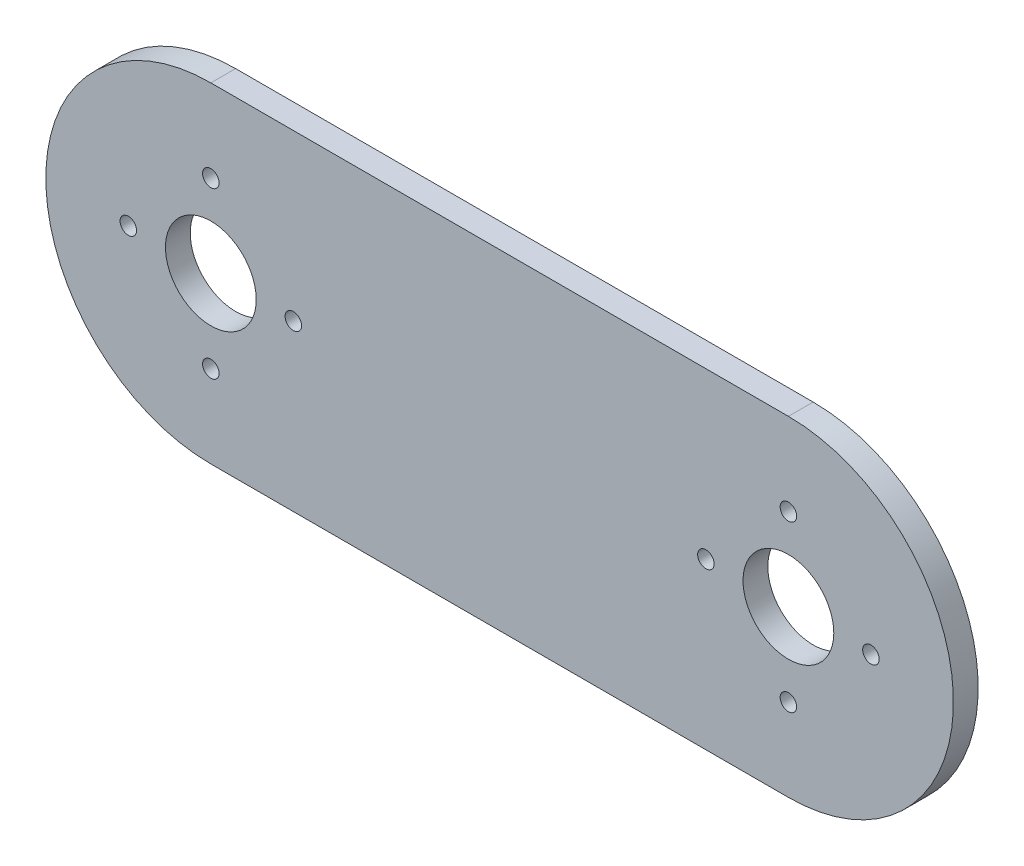
ISO-10303-21;
HEADER;
FILE_DESCRIPTION(('STEP AP214'),'2;1');
FILE_NAME('part.step','',(''),(''),'','','');
FILE_SCHEMA(('AUTOMOTIVE_DESIGN { 1 0 10303 214 1 1 1 1 }'));
ENDSEC;
DATA;
#1=APPLICATION_CONTEXT('core data for automotive mechanical design processes');
#2=APPLICATION_PROTOCOL_DEFINITION('international standard','automotive_design',2000,#1);
#3=PRODUCT_CONTEXT('',#1,'mechanical');
#4=PRODUCT('Part','Part','',(#3));
#5=PRODUCT_RELATED_PRODUCT_CATEGORY('part','',(#4));
#6=PRODUCT_DEFINITION_FORMATION('','',#4);
#7=PRODUCT_DEFINITION_CONTEXT('part definition',#1,'design');
#8=PRODUCT_DEFINITION('design','',#6,#7);
#9=PRODUCT_DEFINITION_SHAPE('','',#8);
#10=(LENGTH_UNIT() NAMED_UNIT(*) SI_UNIT(.MILLI.,.METRE.));
#11=(NAMED_UNIT(*) PLANE_ANGLE_UNIT() SI_UNIT($,.RADIAN.));
#12=(NAMED_UNIT(*) SI_UNIT($,.STERADIAN.) SOLID_ANGLE_UNIT());
#13=UNCERTAINTY_MEASURE_WITH_UNIT(LENGTH_MEASURE(1.E-05),#10,'distance_accuracy_value','');
#14=(GEOMETRIC_REPRESENTATION_CONTEXT(3) GLOBAL_UNCERTAINTY_ASSIGNED_CONTEXT((#13)) GLOBAL_UNIT_ASSIGNED_CONTEXT((#10,
#11,#12)) REPRESENTATION_CONTEXT('',''));
#15=CARTESIAN_POINT('',(0.,0.,0.));
#16=DIRECTION('',(0.,0.,1.));
#17=DIRECTION('',(1.,0.,0.));
#18=AXIS2_PLACEMENT_3D('',#15,#16,#17);
#19=CARTESIAN_POINT('',(0.,0.,3.));
#20=DIRECTION('',(0.,0.,1.));
#21=DIRECTION('',(1.,0.,0.));
#22=AXIS2_PLACEMENT_3D('',#19,#20,#21);
#23=PLANE('',#22);
#24=CARTESIAN_POINT('',(0.,0.,3.));
#25=DIRECTION('',(0.,0.,1.));
#26=DIRECTION('',(1.,0.,0.));
#27=AXIS2_PLACEMENT_3D('',#24,#25,#26);
#28=CIRCLE('',#27,5.5);
#29=CARTESIAN_POINT('',(5.5,0.,3.));
#30=VERTEX_POINT('',#29);
#31=EDGE_CURVE('E161',#30,#30,#28,.T.);
#32=ORIENTED_EDGE('',*,*,#31,.F.);
#33=EDGE_LOOP('',(#32));
#34=FACE_BOUND('',#33,.T.);
#35=CARTESIAN_POINT('',(70.,10.,3.));
#36=DIRECTION('',(0.,0.,1.));
#37=DIRECTION('',(1.,0.,0.));
#38=AXIS2_PLACEMENT_3D('',#35,#36,#37);
#39=CIRCLE('',#38,0.999999999999998);
#40=CARTESIAN_POINT('',(71.,10.,3.));
#41=VERTEX_POINT('',#40);
#42=EDGE_CURVE('E149',#41,#41,#39,.T.);
#43=ORIENTED_EDGE('',*,*,#42,.F.);
#44=EDGE_LOOP('',(#43));
#45=FACE_BOUND('',#44,.T.);
#46=CARTESIAN_POINT('',(0.,10.0000000000001,3.));
#47=DIRECTION('',(0.,0.,1.));
#48=DIRECTION('',(1.,0.,0.));
#49=AXIS2_PLACEMENT_3D('',#46,#47,#48);
#50=CIRCLE('',#49,1.);
#51=CARTESIAN_POINT('',(1.00000000000007,10.0000000000001,3.));
#52=VERTEX_POINT('',#51);
#53=EDGE_CURVE('E137',#52,#52,#50,.T.);
#54=ORIENTED_EDGE('',*,*,#53,.F.);
#55=EDGE_LOOP('',(#54));
#56=FACE_BOUND('',#55,.T.);
#57=CARTESIAN_POINT('',(0.,-9.99999999999993,3.));
#58=DIRECTION('',(0.,0.,1.));
#59=DIRECTION('',(1.,0.,0.));
#60=AXIS2_PLACEMENT_3D('',#57,#58,#59);
#61=CIRCLE('',#60,1.);
#62=CARTESIAN_POINT('',(0.99999999999993,-9.99999999999993,3.));
#63=VERTEX_POINT('',#62);
#64=EDGE_CURVE('E125',#63,#63,#61,.T.);
#65=ORIENTED_EDGE('',*,*,#64,.F.);
#66=EDGE_LOOP('',(#65));
#67=FACE_BOUND('',#66,.T.);
#68=CARTESIAN_POINT('',(10.,0.,3.));
#69=DIRECTION('',(0.,0.,1.));
#70=DIRECTION('',(1.,0.,0.));
#71=AXIS2_PLACEMENT_3D('',#68,#69,#70);
#72=CIRCLE('',#71,1.);
#73=CARTESIAN_POINT('',(11.,0.,3.));
#74=VERTEX_POINT('',#73);
#75=EDGE_CURVE('E104',#74,#74,#72,.T.);
#76=ORIENTED_EDGE('',*,*,#75,.F.);
#77=EDGE_LOOP('',(#76));
#78=FACE_BOUND('',#77,.T.);
#79=CARTESIAN_POINT('',(0.,0.,3.));
#80=DIRECTION('',(0.,0.,1.));
#81=DIRECTION('',(1.,0.,0.));
#82=AXIS2_PLACEMENT_3D('',#79,#80,#81);
#83=CIRCLE('',#82,20.);
#84=CARTESIAN_POINT('',(0.,20.,3.));
#85=VERTEX_POINT('',#84);
#86=CARTESIAN_POINT('',(0.,-20.,3.));
#87=VERTEX_POINT('',#86);
#88=EDGE_CURVE('E89',#85,#87,#83,.T.);
#89=ORIENTED_EDGE('',*,*,#88,.T.);
#90=DIRECTION('',(1.,0.,0.));
#91=VECTOR('',#90,1.);
#92=CARTESIAN_POINT('',(0.,-20.,3.));
#93=LINE('',#92,#91);
#94=CARTESIAN_POINT('',(70.,-20.,3.));
#95=VERTEX_POINT('',#94);
#96=EDGE_CURVE('E84',#87,#95,#93,.T.);
#97=ORIENTED_EDGE('',*,*,#96,.T.);
#98=CARTESIAN_POINT('',(70.,0.,3.));
#99=DIRECTION('',(0.,0.,1.));
#100=DIRECTION('',(1.,0.,0.));
#101=AXIS2_PLACEMENT_3D('',#98,#99,#100);
#102=CIRCLE('',#101,20.);
#103=CARTESIAN_POINT('',(70.,20.,3.));
#104=VERTEX_POINT('',#103);
#105=EDGE_CURVE('E87',#95,#104,#102,.T.);
#106=ORIENTED_EDGE('',*,*,#105,.T.);
#107=DIRECTION('',(-1.,0.,0.));
#108=VECTOR('',#107,1.);
#109=CARTESIAN_POINT('',(0.,20.,3.));
#110=LINE('',#109,#108);
#111=EDGE_CURVE('E54',#104,#85,#110,.T.);
#112=ORIENTED_EDGE('',*,*,#111,.T.);
#113=EDGE_LOOP('',(#89,#97,#106,#112));
#114=FACE_BOUND('',#113,.T.);
#115=CARTESIAN_POINT('',(80.,0.,3.));
#116=DIRECTION('',(0.,0.,1.));
#117=DIRECTION('',(1.,0.,0.));
#118=AXIS2_PLACEMENT_3D('',#115,#116,#117);
#119=CIRCLE('',#118,0.999999999999998);
#120=CARTESIAN_POINT('',(81.,0.,3.));
#121=VERTEX_POINT('',#120);
#122=EDGE_CURVE('E119',#121,#121,#119,.T.);
#123=ORIENTED_EDGE('',*,*,#122,.F.);
#124=EDGE_LOOP('',(#123));
#125=FACE_BOUND('',#124,.T.);
#126=CARTESIAN_POINT('',(-10.,1.41028062308632E-13,3.));
#127=DIRECTION('',(0.,0.,1.));
#128=DIRECTION('',(1.,0.,0.));
#129=AXIS2_PLACEMENT_3D('',#126,#127,#128);
#130=CIRCLE('',#129,1.);
#131=CARTESIAN_POINT('',(-9.,1.41028062308632E-13,3.));
#132=VERTEX_POINT('',#131);
#133=EDGE_CURVE('E131',#132,#132,#130,.T.);
#134=ORIENTED_EDGE('',*,*,#133,.F.);
#135=EDGE_LOOP('',(#134));
#136=FACE_BOUND('',#135,.T.);
#137=CARTESIAN_POINT('',(60.,0.,3.));
#138=DIRECTION('',(0.,0.,1.));
#139=DIRECTION('',(1.,0.,0.));
#140=AXIS2_PLACEMENT_3D('',#137,#138,#139);
#141=CIRCLE('',#140,0.999999999999998);
#142=CARTESIAN_POINT('',(61.,0.,3.));
#143=VERTEX_POINT('',#142);
#144=EDGE_CURVE('E143',#143,#143,#141,.T.);
#145=ORIENTED_EDGE('',*,*,#144,.F.);
#146=EDGE_LOOP('',(#145));
#147=FACE_BOUND('',#146,.T.);
#148=CARTESIAN_POINT('',(70.,-10.,3.));
#149=DIRECTION('',(0.,0.,1.));
#150=DIRECTION('',(1.,0.,0.));
#151=AXIS2_PLACEMENT_3D('',#148,#149,#150);
#152=CIRCLE('',#151,0.999999999999998);
#153=CARTESIAN_POINT('',(71.,-10.,3.));
#154=VERTEX_POINT('',#153);
#155=EDGE_CURVE('E155',#154,#154,#152,.T.);
#156=ORIENTED_EDGE('',*,*,#155,.F.);
#157=EDGE_LOOP('',(#156));
#158=FACE_BOUND('',#157,.T.);
#159=CARTESIAN_POINT('',(70.,0.,3.));
#160=DIRECTION('',(0.,0.,1.));
#161=DIRECTION('',(1.,0.,0.));
#162=AXIS2_PLACEMENT_3D('',#159,#160,#161);
#163=CIRCLE('',#162,5.5);
#164=CARTESIAN_POINT('',(75.5,0.,3.));
#165=VERTEX_POINT('',#164);
#166=EDGE_CURVE('E167',#165,#165,#163,.T.);
#167=ORIENTED_EDGE('',*,*,#166,.F.);
#168=EDGE_LOOP('',(#167));
#169=FACE_BOUND('',#168,.T.);
#170=ADVANCED_FACE('F37',(#34,#45,#56,#67,#78,#114,#125,#136,#147,#158,#169),#23,.T.);
#171=CARTESIAN_POINT('',(0.,0.,0.));
#172=DIRECTION('',(0.,0.,1.));
#173=DIRECTION('',(1.,0.,0.));
#174=AXIS2_PLACEMENT_3D('',#171,#172,#173);
#175=PLANE('',#174);
#176=CARTESIAN_POINT('',(0.,0.,0.));
#177=DIRECTION('',(0.,0.,1.));
#178=DIRECTION('',(1.,0.,0.));
#179=AXIS2_PLACEMENT_3D('',#176,#177,#178);
#180=CIRCLE('',#179,5.5);
#181=CARTESIAN_POINT('',(5.5,0.,0.));
#182=VERTEX_POINT('',#181);
#183=EDGE_CURVE('E164',#182,#182,#180,.T.);
#184=ORIENTED_EDGE('',*,*,#183,.T.);
#185=EDGE_LOOP('',(#184));
#186=FACE_BOUND('',#185,.T.);
#187=CARTESIAN_POINT('',(70.,10.,0.));
#188=DIRECTION('',(0.,0.,1.));
#189=DIRECTION('',(1.,0.,0.));
#190=AXIS2_PLACEMENT_3D('',#187,#188,#189);
#191=CIRCLE('',#190,0.999999999999998);
#192=CARTESIAN_POINT('',(71.,10.,0.));
#193=VERTEX_POINT('',#192);
#194=EDGE_CURVE('E152',#193,#193,#191,.T.);
#195=ORIENTED_EDGE('',*,*,#194,.T.);
#196=EDGE_LOOP('',(#195));
#197=FACE_BOUND('',#196,.T.);
#198=CARTESIAN_POINT('',(0.,10.0000000000001,0.));
#199=DIRECTION('',(0.,0.,1.));
#200=DIRECTION('',(1.,0.,0.));
#201=AXIS2_PLACEMENT_3D('',#198,#199,#200);
#202=CIRCLE('',#201,1.);
#203=CARTESIAN_POINT('',(1.00000000000007,10.0000000000001,0.));
#204=VERTEX_POINT('',#203);
#205=EDGE_CURVE('E140',#204,#204,#202,.T.);
#206=ORIENTED_EDGE('',*,*,#205,.T.);
#207=EDGE_LOOP('',(#206));
#208=FACE_BOUND('',#207,.T.);
#209=CARTESIAN_POINT('',(0.,-9.99999999999993,0.));
#210=DIRECTION('',(0.,0.,1.));
#211=DIRECTION('',(1.,0.,0.));
#212=AXIS2_PLACEMENT_3D('',#209,#210,#211);
#213=CIRCLE('',#212,1.);
#214=CARTESIAN_POINT('',(0.99999999999993,-9.99999999999993,0.));
#215=VERTEX_POINT('',#214);
#216=EDGE_CURVE('E128',#215,#215,#213,.T.);
#217=ORIENTED_EDGE('',*,*,#216,.T.);
#218=EDGE_LOOP('',(#217));
#219=FACE_BOUND('',#218,.T.);
#220=CARTESIAN_POINT('',(10.,0.,0.));
#221=DIRECTION('',(0.,0.,1.));
#222=DIRECTION('',(1.,0.,0.));
#223=AXIS2_PLACEMENT_3D('',#220,#221,#222);
#224=CIRCLE('',#223,1.);
#225=CARTESIAN_POINT('',(11.,0.,0.));
#226=VERTEX_POINT('',#225);
#227=EDGE_CURVE('E116',#226,#226,#224,.T.);
#228=ORIENTED_EDGE('',*,*,#227,.T.);
#229=EDGE_LOOP('',(#228));
#230=FACE_BOUND('',#229,.T.);
#231=CARTESIAN_POINT('',(0.,0.,0.));
#232=DIRECTION('',(0.,0.,1.));
#233=DIRECTION('',(1.,0.,0.));
#234=AXIS2_PLACEMENT_3D('',#231,#232,#233);
#235=CIRCLE('',#234,20.);
#236=CARTESIAN_POINT('',(0.,20.,0.));
#237=VERTEX_POINT('',#236);
#238=CARTESIAN_POINT('',(0.,-20.,0.));
#239=VERTEX_POINT('',#238);
#240=EDGE_CURVE('E101',#237,#239,#235,.T.);
#241=ORIENTED_EDGE('',*,*,#240,.F.);
#242=DIRECTION('',(-1.,0.,0.));
#243=VECTOR('',#242,1.);
#244=CARTESIAN_POINT('',(0.,20.,0.));
#245=LINE('',#244,#243);
#246=CARTESIAN_POINT('',(70.,20.,0.));
#247=VERTEX_POINT('',#246);
#248=EDGE_CURVE('E77',#247,#237,#245,.T.);
#249=ORIENTED_EDGE('',*,*,#248,.F.);
#250=CARTESIAN_POINT('',(70.,0.,0.));
#251=DIRECTION('',(0.,0.,1.));
#252=DIRECTION('',(1.,0.,0.));
#253=AXIS2_PLACEMENT_3D('',#250,#251,#252);
#254=CIRCLE('',#253,20.);
#255=CARTESIAN_POINT('',(70.,-20.,0.));
#256=VERTEX_POINT('',#255);
#257=EDGE_CURVE('E71',#256,#247,#254,.T.);
#258=ORIENTED_EDGE('',*,*,#257,.F.);
#259=DIRECTION('',(1.,0.,0.));
#260=VECTOR('',#259,1.);
#261=CARTESIAN_POINT('',(0.,-20.,0.));
#262=LINE('',#261,#260);
#263=EDGE_CURVE('E93',#239,#256,#262,.T.);
#264=ORIENTED_EDGE('',*,*,#263,.F.);
#265=EDGE_LOOP('',(#241,#249,#258,#264));
#266=FACE_BOUND('',#265,.T.);
#267=CARTESIAN_POINT('',(80.,0.,0.));
#268=DIRECTION('',(0.,0.,1.));
#269=DIRECTION('',(1.,0.,0.));
#270=AXIS2_PLACEMENT_3D('',#267,#268,#269);
#271=CIRCLE('',#270,0.999999999999998);
#272=CARTESIAN_POINT('',(81.,0.,0.));
#273=VERTEX_POINT('',#272);
#274=EDGE_CURVE('E122',#273,#273,#271,.T.);
#275=ORIENTED_EDGE('',*,*,#274,.T.);
#276=EDGE_LOOP('',(#275));
#277=FACE_BOUND('',#276,.T.);
#278=CARTESIAN_POINT('',(-10.,1.41028062308632E-13,0.));
#279=DIRECTION('',(0.,0.,1.));
#280=DIRECTION('',(1.,0.,0.));
#281=AXIS2_PLACEMENT_3D('',#278,#279,#280);
#282=CIRCLE('',#281,1.);
#283=CARTESIAN_POINT('',(-9.,1.41028062308632E-13,0.));
#284=VERTEX_POINT('',#283);
#285=EDGE_CURVE('E134',#284,#284,#282,.T.);
#286=ORIENTED_EDGE('',*,*,#285,.T.);
#287=EDGE_LOOP('',(#286));
#288=FACE_BOUND('',#287,.T.);
#289=CARTESIAN_POINT('',(60.,0.,0.));
#290=DIRECTION('',(0.,0.,1.));
#291=DIRECTION('',(1.,0.,0.));
#292=AXIS2_PLACEMENT_3D('',#289,#290,#291);
#293=CIRCLE('',#292,0.999999999999998);
#294=CARTESIAN_POINT('',(61.,0.,0.));
#295=VERTEX_POINT('',#294);
#296=EDGE_CURVE('E146',#295,#295,#293,.T.);
#297=ORIENTED_EDGE('',*,*,#296,.T.);
#298=EDGE_LOOP('',(#297));
#299=FACE_BOUND('',#298,.T.);
#300=CARTESIAN_POINT('',(70.,-10.,0.));
#301=DIRECTION('',(0.,0.,1.));
#302=DIRECTION('',(1.,0.,0.));
#303=AXIS2_PLACEMENT_3D('',#300,#301,#302);
#304=CIRCLE('',#303,0.999999999999998);
#305=CARTESIAN_POINT('',(71.,-10.,0.));
#306=VERTEX_POINT('',#305);
#307=EDGE_CURVE('E158',#306,#306,#304,.T.);
#308=ORIENTED_EDGE('',*,*,#307,.T.);
#309=EDGE_LOOP('',(#308));
#310=FACE_BOUND('',#309,.T.);
#311=CARTESIAN_POINT('',(70.,0.,0.));
#312=DIRECTION('',(0.,0.,1.));
#313=DIRECTION('',(1.,0.,0.));
#314=AXIS2_PLACEMENT_3D('',#311,#312,#313);
#315=CIRCLE('',#314,5.5);
#316=CARTESIAN_POINT('',(75.5,0.,0.));
#317=VERTEX_POINT('',#316);
#318=EDGE_CURVE('E170',#317,#317,#315,.T.);
#319=ORIENTED_EDGE('',*,*,#318,.T.);
#320=EDGE_LOOP('',(#319));
#321=FACE_BOUND('',#320,.T.);
#322=ADVANCED_FACE('F112',(#186,#197,#208,#219,#230,#266,#277,#288,#299,#310,#321),#175,.F.);
#323=CARTESIAN_POINT('',(0.,0.,3.));
#324=DIRECTION('',(0.,0.,-1.));
#325=DIRECTION('',(-1.,0.,0.));
#326=AXIS2_PLACEMENT_3D('',#323,#324,#325);
#327=CYLINDRICAL_SURFACE('',#326,20.);
#328=ORIENTED_EDGE('',*,*,#240,.T.);
#329=DIRECTION('',(0.,0.,-1.));
#330=VECTOR('',#329,1.);
#331=CARTESIAN_POINT('',(0.,-20.,3.));
#332=LINE('',#331,#330);
#333=EDGE_CURVE('E11',#87,#239,#332,.T.);
#334=ORIENTED_EDGE('',*,*,#333,.F.);
#335=ORIENTED_EDGE('',*,*,#88,.F.);
#336=DIRECTION('',(0.,0.,-1.));
#337=VECTOR('',#336,1.);
#338=CARTESIAN_POINT('',(0.,20.,3.));
#339=LINE('',#338,#337);
#340=EDGE_CURVE('E97',#85,#237,#339,.T.);
#341=ORIENTED_EDGE('',*,*,#340,.T.);
#342=EDGE_LOOP('',(#328,#334,#335,#341));
#343=FACE_BOUND('',#342,.T.);
#344=ADVANCED_FACE('F39',(#343),#327,.T.);
#345=CARTESIAN_POINT('',(0.,-20.,3.));
#346=DIRECTION('',(0.,1.,0.));
#347=DIRECTION('',(0.,0.,1.));
#348=AXIS2_PLACEMENT_3D('',#345,#346,#347);
#349=PLANE('',#348);
#350=ORIENTED_EDGE('',*,*,#263,.T.);
#351=DIRECTION('',(0.,0.,-1.));
#352=VECTOR('',#351,1.);
#353=CARTESIAN_POINT('',(70.,-20.,3.));
#354=LINE('',#353,#352);
#355=EDGE_CURVE('E46',#95,#256,#354,.T.);
#356=ORIENTED_EDGE('',*,*,#355,.F.);
#357=ORIENTED_EDGE('',*,*,#96,.F.);
#358=ORIENTED_EDGE('',*,*,#333,.T.);
#359=EDGE_LOOP('',(#350,#356,#357,#358));
#360=FACE_BOUND('',#359,.T.);
#361=ADVANCED_FACE('F92',(#360),#349,.F.);
#362=CARTESIAN_POINT('',(70.,0.,3.));
#363=DIRECTION('',(0.,0.,-1.));
#364=DIRECTION('',(-1.,0.,0.));
#365=AXIS2_PLACEMENT_3D('',#362,#363,#364);
#366=CYLINDRICAL_SURFACE('',#365,20.);
#367=ORIENTED_EDGE('',*,*,#257,.T.);
#368=DIRECTION('',(0.,0.,-1.));
#369=VECTOR('',#368,1.);
#370=CARTESIAN_POINT('',(70.,20.,3.));
#371=LINE('',#370,#369);
#372=EDGE_CURVE('E94',#104,#247,#371,.T.);
#373=ORIENTED_EDGE('',*,*,#372,.F.);
#374=ORIENTED_EDGE('',*,*,#105,.F.);
#375=ORIENTED_EDGE('',*,*,#355,.T.);
#376=EDGE_LOOP('',(#367,#373,#374,#375));
#377=FACE_BOUND('',#376,.T.);
#378=ADVANCED_FACE('F95',(#377),#366,.T.);
#379=CARTESIAN_POINT('',(0.,20.,3.));
#380=DIRECTION('',(0.,-1.,0.));
#381=DIRECTION('',(0.,0.,-1.));
#382=AXIS2_PLACEMENT_3D('',#379,#380,#381);
#383=PLANE('',#382);
#384=ORIENTED_EDGE('',*,*,#248,.T.);
#385=ORIENTED_EDGE('',*,*,#340,.F.);
#386=ORIENTED_EDGE('',*,*,#111,.F.);
#387=ORIENTED_EDGE('',*,*,#372,.T.);
#388=EDGE_LOOP('',(#384,#385,#386,#387));
#389=FACE_BOUND('',#388,.T.);
#390=ADVANCED_FACE('F109',(#389),#383,.F.);
#391=CARTESIAN_POINT('',(10.,0.,3.));
#392=DIRECTION('',(0.,0.,-1.));
#393=DIRECTION('',(-1.,0.,0.));
#394=AXIS2_PLACEMENT_3D('',#391,#392,#393);
#395=CYLINDRICAL_SURFACE('',#394,1.);
#396=ORIENTED_EDGE('',*,*,#75,.T.);
#397=EDGE_LOOP('',(#396));
#398=FACE_BOUND('',#397,.T.);
#399=ORIENTED_EDGE('',*,*,#227,.F.);
#400=EDGE_LOOP('',(#399));
#401=FACE_BOUND('',#400,.T.);
#402=ADVANCED_FACE('F190',(#398,#401),#395,.F.);
#403=CARTESIAN_POINT('',(80.,0.,3.));
#404=DIRECTION('',(0.,0.,-1.));
#405=DIRECTION('',(-1.,0.,0.));
#406=AXIS2_PLACEMENT_3D('',#403,#404,#405);
#407=CYLINDRICAL_SURFACE('',#406,0.999999999999998);
#408=ORIENTED_EDGE('',*,*,#122,.T.);
#409=EDGE_LOOP('',(#408));
#410=FACE_BOUND('',#409,.T.);
#411=ORIENTED_EDGE('',*,*,#274,.F.);
#412=EDGE_LOOP('',(#411));
#413=FACE_BOUND('',#412,.T.);
#414=ADVANCED_FACE('F236',(#410,#413),#407,.F.);
#415=CARTESIAN_POINT('',(0.,-9.99999999999993,3.));
#416=DIRECTION('',(0.,0.,-1.));
#417=DIRECTION('',(-1.,0.,0.));
#418=AXIS2_PLACEMENT_3D('',#415,#416,#417);
#419=CYLINDRICAL_SURFACE('',#418,1.);
#420=ORIENTED_EDGE('',*,*,#64,.T.);
#421=EDGE_LOOP('',(#420));
#422=FACE_BOUND('',#421,.T.);
#423=ORIENTED_EDGE('',*,*,#216,.F.);
#424=EDGE_LOOP('',(#423));
#425=FACE_BOUND('',#424,.T.);
#426=ADVANCED_FACE('F244',(#422,#425),#419,.F.);
#427=CARTESIAN_POINT('',(-10.,1.41028062308632E-13,3.));
#428=DIRECTION('',(0.,0.,-1.));
#429=DIRECTION('',(-1.,0.,0.));
#430=AXIS2_PLACEMENT_3D('',#427,#428,#429);
#431=CYLINDRICAL_SURFACE('',#430,1.);
#432=ORIENTED_EDGE('',*,*,#133,.T.);
#433=EDGE_LOOP('',(#432));
#434=FACE_BOUND('',#433,.T.);
#435=ORIENTED_EDGE('',*,*,#285,.F.);
#436=EDGE_LOOP('',(#435));
#437=FACE_BOUND('',#436,.T.);
#438=ADVANCED_FACE('F252',(#434,#437),#431,.F.);
#439=CARTESIAN_POINT('',(0.,10.0000000000001,3.));
#440=DIRECTION('',(0.,0.,-1.));
#441=DIRECTION('',(-1.,0.,0.));
#442=AXIS2_PLACEMENT_3D('',#439,#440,#441);
#443=CYLINDRICAL_SURFACE('',#442,1.);
#444=ORIENTED_EDGE('',*,*,#53,.T.);
#445=EDGE_LOOP('',(#444));
#446=FACE_BOUND('',#445,.T.);
#447=ORIENTED_EDGE('',*,*,#205,.F.);
#448=EDGE_LOOP('',(#447));
#449=FACE_BOUND('',#448,.T.);
#450=ADVANCED_FACE('F261',(#446,#449),#443,.F.);
#451=CARTESIAN_POINT('',(60.,0.,3.));
#452=DIRECTION('',(0.,0.,-1.));
#453=DIRECTION('',(-1.,0.,0.));
#454=AXIS2_PLACEMENT_3D('',#451,#452,#453);
#455=CYLINDRICAL_SURFACE('',#454,0.999999999999998);
#456=ORIENTED_EDGE('',*,*,#144,.T.);
#457=EDGE_LOOP('',(#456));
#458=FACE_BOUND('',#457,.T.);
#459=ORIENTED_EDGE('',*,*,#296,.F.);
#460=EDGE_LOOP('',(#459));
#461=FACE_BOUND('',#460,.T.);
#462=ADVANCED_FACE('F270',(#458,#461),#455,.F.);
#463=CARTESIAN_POINT('',(70.,10.,3.));
#464=DIRECTION('',(0.,0.,-1.));
#465=DIRECTION('',(-1.,0.,0.));
#466=AXIS2_PLACEMENT_3D('',#463,#464,#465);
#467=CYLINDRICAL_SURFACE('',#466,0.999999999999998);
#468=ORIENTED_EDGE('',*,*,#42,.T.);
#469=EDGE_LOOP('',(#468));
#470=FACE_BOUND('',#469,.T.);
#471=ORIENTED_EDGE('',*,*,#194,.F.);
#472=EDGE_LOOP('',(#471));
#473=FACE_BOUND('',#472,.T.);
#474=ADVANCED_FACE('F279',(#470,#473),#467,.F.);
#475=CARTESIAN_POINT('',(70.,-10.,3.));
#476=DIRECTION('',(0.,0.,-1.));
#477=DIRECTION('',(-1.,0.,0.));
#478=AXIS2_PLACEMENT_3D('',#475,#476,#477);
#479=CYLINDRICAL_SURFACE('',#478,0.999999999999998);
#480=ORIENTED_EDGE('',*,*,#155,.T.);
#481=EDGE_LOOP('',(#480));
#482=FACE_BOUND('',#481,.T.);
#483=ORIENTED_EDGE('',*,*,#307,.F.);
#484=EDGE_LOOP('',(#483));
#485=FACE_BOUND('',#484,.T.);
#486=ADVANCED_FACE('F288',(#482,#485),#479,.F.);
#487=CARTESIAN_POINT('',(0.,0.,3.));
#488=DIRECTION('',(0.,0.,-1.));
#489=DIRECTION('',(-1.,0.,0.));
#490=AXIS2_PLACEMENT_3D('',#487,#488,#489);
#491=CYLINDRICAL_SURFACE('',#490,5.5);
#492=ORIENTED_EDGE('',*,*,#31,.T.);
#493=EDGE_LOOP('',(#492));
#494=FACE_BOUND('',#493,.T.);
#495=ORIENTED_EDGE('',*,*,#183,.F.);
#496=EDGE_LOOP('',(#495));
#497=FACE_BOUND('',#496,.T.);
#498=ADVANCED_FACE('F297',(#494,#497),#491,.F.);
#499=CARTESIAN_POINT('',(70.,0.,3.));
#500=DIRECTION('',(0.,0.,-1.));
#501=DIRECTION('',(-1.,0.,0.));
#502=AXIS2_PLACEMENT_3D('',#499,#500,#501);
#503=CYLINDRICAL_SURFACE('',#502,5.5);
#504=ORIENTED_EDGE('',*,*,#166,.T.);
#505=EDGE_LOOP('',(#504));
#506=FACE_BOUND('',#505,.T.);
#507=ORIENTED_EDGE('',*,*,#318,.F.);
#508=EDGE_LOOP('',(#507));
#509=FACE_BOUND('',#508,.T.);
#510=ADVANCED_FACE('F176',(#506,#509),#503,.F.);
#511=CLOSED_SHELL('',(#170,#322,#344,#361,#378,#390,#402,#414,#426,#438,#450,#462,#474,#486,
#498,#510));
#512=MANIFOLD_SOLID_BREP('B2',#511);
#513=ADVANCED_BREP_SHAPE_REPRESENTATION('',(#18,#512),#14);
#514=SHAPE_DEFINITION_REPRESENTATION(#9,#513);
ENDSEC;
END-ISO-10303-21;
